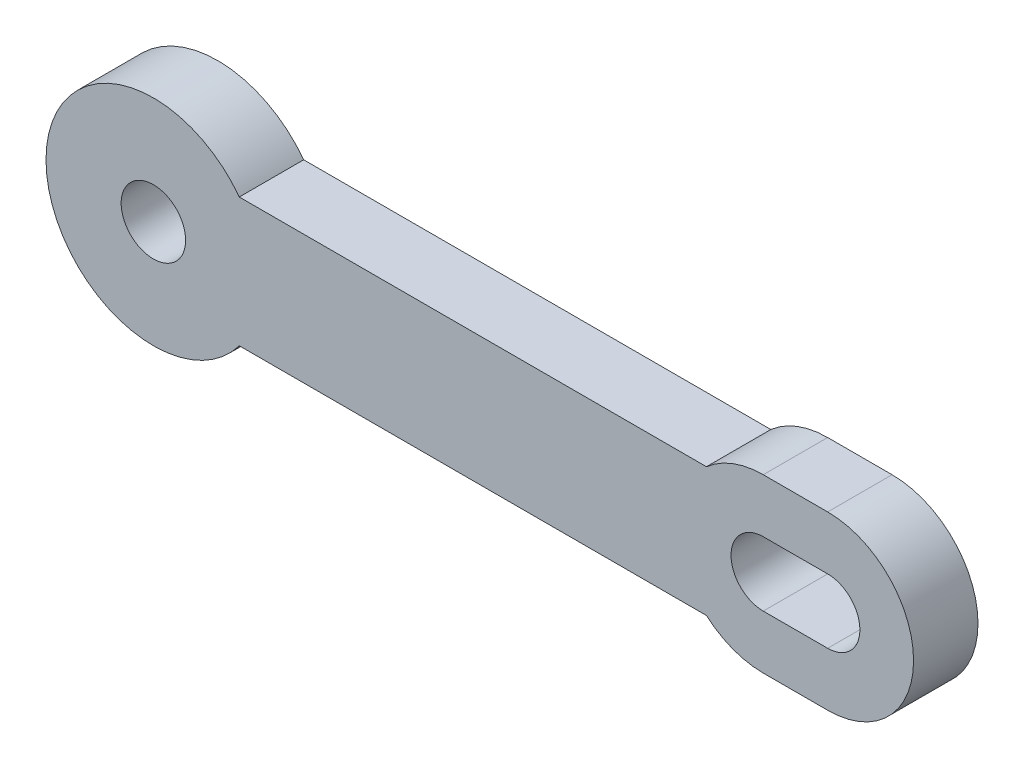
ISO-10303-21;
HEADER;
FILE_DESCRIPTION(('STEP AP214'),'2;1');
FILE_NAME('part.step','',(''),(''),'','','');
FILE_SCHEMA(('AUTOMOTIVE_DESIGN { 1 0 10303 214 1 1 1 1 }'));
ENDSEC;
DATA;
#1=APPLICATION_CONTEXT('core data for automotive mechanical design processes');
#2=APPLICATION_PROTOCOL_DEFINITION('international standard','automotive_design',2000,#1);
#3=PRODUCT_CONTEXT('',#1,'mechanical');
#4=PRODUCT('Part','Part','',(#3));
#5=PRODUCT_RELATED_PRODUCT_CATEGORY('part','',(#4));
#6=PRODUCT_DEFINITION_FORMATION('','',#4);
#7=PRODUCT_DEFINITION_CONTEXT('part definition',#1,'design');
#8=PRODUCT_DEFINITION('design','',#6,#7);
#9=PRODUCT_DEFINITION_SHAPE('','',#8);
#10=(LENGTH_UNIT() NAMED_UNIT(*) SI_UNIT(.MILLI.,.METRE.));
#11=(NAMED_UNIT(*) PLANE_ANGLE_UNIT() SI_UNIT($,.RADIAN.));
#12=(NAMED_UNIT(*) SI_UNIT($,.STERADIAN.) SOLID_ANGLE_UNIT());
#13=UNCERTAINTY_MEASURE_WITH_UNIT(LENGTH_MEASURE(1.E-05),#10,'distance_accuracy_value','');
#14=(GEOMETRIC_REPRESENTATION_CONTEXT(3) GLOBAL_UNCERTAINTY_ASSIGNED_CONTEXT((#13)) GLOBAL_UNIT_ASSIGNED_CONTEXT((#10,
#11,#12)) REPRESENTATION_CONTEXT('',''));
#15=CARTESIAN_POINT('',(0.,0.,0.));
#16=DIRECTION('',(0.,0.,1.));
#17=DIRECTION('',(1.,0.,0.));
#18=AXIS2_PLACEMENT_3D('',#15,#16,#17);
#19=CARTESIAN_POINT('',(31.4,0.,3.));
#20=DIRECTION('',(0.,0.,-1.));
#21=DIRECTION('',(-1.,0.,0.));
#22=AXIS2_PLACEMENT_3D('',#19,#20,#21);
#23=CYLINDRICAL_SURFACE('',#22,1.50000000000002);
#24=CARTESIAN_POINT('',(31.4,0.,0.));
#25=DIRECTION('',(0.,0.,1.));
#26=DIRECTION('',(1.,0.,0.));
#27=AXIS2_PLACEMENT_3D('',#24,#25,#26);
#28=CIRCLE('',#27,1.50000000000002);
#29=CARTESIAN_POINT('',(31.4,-1.5,0.));
#30=VERTEX_POINT('',#29);
#31=CARTESIAN_POINT('',(31.4,1.5,0.));
#32=VERTEX_POINT('',#31);
#33=EDGE_CURVE('E180',#30,#32,#28,.T.);
#34=ORIENTED_EDGE('',*,*,#33,.F.);
#35=DIRECTION('',(0.,0.,-1.));
#36=VECTOR('',#35,1.);
#37=CARTESIAN_POINT('',(31.4,-1.5,3.));
#38=LINE('',#37,#36);
#39=CARTESIAN_POINT('',(31.4,-1.5,3.));
#40=VERTEX_POINT('',#39);
#41=EDGE_CURVE('E11',#40,#30,#38,.T.);
#42=ORIENTED_EDGE('',*,*,#41,.F.);
#43=CARTESIAN_POINT('',(31.4,0.,3.));
#44=DIRECTION('',(0.,0.,1.));
#45=DIRECTION('',(1.,0.,0.));
#46=AXIS2_PLACEMENT_3D('',#43,#44,#45);
#47=CIRCLE('',#46,1.50000000000002);
#48=CARTESIAN_POINT('',(31.4,1.5,3.));
#49=VERTEX_POINT('',#48);
#50=EDGE_CURVE('E150',#40,#49,#47,.T.);
#51=ORIENTED_EDGE('',*,*,#50,.T.);
#52=DIRECTION('',(0.,0.,-1.));
#53=VECTOR('',#52,1.);
#54=CARTESIAN_POINT('',(31.4,1.5,3.));
#55=LINE('',#54,#53);
#56=EDGE_CURVE('E102',#49,#32,#55,.T.);
#57=ORIENTED_EDGE('',*,*,#56,.T.);
#58=EDGE_LOOP('',(#34,#42,#51,#57));
#59=FACE_BOUND('',#58,.T.);
#60=ADVANCED_FACE('F37',(#59),#23,.F.);
#61=CARTESIAN_POINT('',(0.,-1.5,3.));
#62=DIRECTION('',(0.,1.,0.));
#63=DIRECTION('',(0.,0.,1.));
#64=AXIS2_PLACEMENT_3D('',#61,#62,#63);
#65=PLANE('',#64);
#66=DIRECTION('',(1.,0.,0.));
#67=VECTOR('',#66,1.);
#68=CARTESIAN_POINT('',(0.,-1.5,0.));
#69=LINE('',#68,#67);
#70=CARTESIAN_POINT('',(28.4,-1.5,0.));
#71=VERTEX_POINT('',#70);
#72=EDGE_CURVE('E142',#71,#30,#69,.T.);
#73=ORIENTED_EDGE('',*,*,#72,.F.);
#74=DIRECTION('',(0.,0.,-1.));
#75=VECTOR('',#74,1.);
#76=CARTESIAN_POINT('',(28.4,-1.5,3.));
#77=LINE('',#76,#75);
#78=CARTESIAN_POINT('',(28.4,-1.5,3.));
#79=VERTEX_POINT('',#78);
#80=EDGE_CURVE('E47',#79,#71,#77,.T.);
#81=ORIENTED_EDGE('',*,*,#80,.F.);
#82=DIRECTION('',(1.,0.,0.));
#83=VECTOR('',#82,1.);
#84=CARTESIAN_POINT('',(0.,-1.5,3.));
#85=LINE('',#84,#83);
#86=EDGE_CURVE('E140',#79,#40,#85,.T.);
#87=ORIENTED_EDGE('',*,*,#86,.T.);
#88=ORIENTED_EDGE('',*,*,#41,.T.);
#89=EDGE_LOOP('',(#73,#81,#87,#88));
#90=FACE_BOUND('',#89,.T.);
#91=ADVANCED_FACE('F139',(#90),#65,.T.);
#92=CARTESIAN_POINT('',(28.4,0.,3.));
#93=DIRECTION('',(0.,0.,-1.));
#94=DIRECTION('',(-1.,0.,0.));
#95=AXIS2_PLACEMENT_3D('',#92,#93,#94);
#96=CYLINDRICAL_SURFACE('',#95,1.5);
#97=CARTESIAN_POINT('',(28.4,0.,0.));
#98=DIRECTION('',(0.,0.,1.));
#99=DIRECTION('',(1.,0.,0.));
#100=AXIS2_PLACEMENT_3D('',#97,#98,#99);
#101=CIRCLE('',#100,1.5);
#102=CARTESIAN_POINT('',(28.4,1.5,0.));
#103=VERTEX_POINT('',#102);
#104=EDGE_CURVE('E184',#103,#71,#101,.T.);
#105=ORIENTED_EDGE('',*,*,#104,.F.);
#106=DIRECTION('',(0.,0.,-1.));
#107=VECTOR('',#106,1.);
#108=CARTESIAN_POINT('',(28.4,1.5,3.));
#109=LINE('',#108,#107);
#110=CARTESIAN_POINT('',(28.4,1.5,3.));
#111=VERTEX_POINT('',#110);
#112=EDGE_CURVE('E95',#111,#103,#109,.T.);
#113=ORIENTED_EDGE('',*,*,#112,.F.);
#114=CARTESIAN_POINT('',(28.4,0.,3.));
#115=DIRECTION('',(0.,0.,1.));
#116=DIRECTION('',(1.,0.,0.));
#117=AXIS2_PLACEMENT_3D('',#114,#115,#116);
#118=CIRCLE('',#117,1.5);
#119=EDGE_CURVE('E149',#111,#79,#118,.T.);
#120=ORIENTED_EDGE('',*,*,#119,.T.);
#121=ORIENTED_EDGE('',*,*,#80,.T.);
#122=EDGE_LOOP('',(#105,#113,#120,#121));
#123=FACE_BOUND('',#122,.T.);
#124=ADVANCED_FACE('F152',(#123),#96,.F.);
#125=CARTESIAN_POINT('',(0.,0.,3.));
#126=DIRECTION('',(0.,0.,-1.));
#127=DIRECTION('',(-1.,0.,0.));
#128=AXIS2_PLACEMENT_3D('',#125,#126,#127);
#129=CYLINDRICAL_SURFACE('',#128,5.);
#130=CARTESIAN_POINT('',(0.,0.,0.));
#131=DIRECTION('',(0.,0.,1.));
#132=DIRECTION('',(1.,0.,0.));
#133=AXIS2_PLACEMENT_3D('',#130,#131,#132);
#134=CIRCLE('',#133,5.);
#135=CARTESIAN_POINT('',(4.,3.,0.));
#136=VERTEX_POINT('',#135);
#137=CARTESIAN_POINT('',(4.,-3.,0.));
#138=VERTEX_POINT('',#137);
#139=EDGE_CURVE('E158',#136,#138,#134,.T.);
#140=ORIENTED_EDGE('',*,*,#139,.T.);
#141=DIRECTION('',(0.,0.,-1.));
#142=VECTOR('',#141,1.);
#143=CARTESIAN_POINT('',(4.,-3.,3.));
#144=LINE('',#143,#142);
#145=CARTESIAN_POINT('',(4.,-3.,3.));
#146=VERTEX_POINT('',#145);
#147=EDGE_CURVE('E41',#146,#138,#144,.T.);
#148=ORIENTED_EDGE('',*,*,#147,.F.);
#149=CARTESIAN_POINT('',(0.,0.,3.));
#150=DIRECTION('',(0.,0.,1.));
#151=DIRECTION('',(1.,0.,0.));
#152=AXIS2_PLACEMENT_3D('',#149,#150,#151);
#153=CIRCLE('',#152,5.);
#154=CARTESIAN_POINT('',(4.,3.,3.));
#155=VERTEX_POINT('',#154);
#156=EDGE_CURVE('E188',#155,#146,#153,.T.);
#157=ORIENTED_EDGE('',*,*,#156,.F.);
#158=DIRECTION('',(0.,0.,-1.));
#159=VECTOR('',#158,1.);
#160=CARTESIAN_POINT('',(4.,3.,3.));
#161=LINE('',#160,#159);
#162=EDGE_CURVE('E154',#155,#136,#161,.T.);
#163=ORIENTED_EDGE('',*,*,#162,.T.);
#164=EDGE_LOOP('',(#140,#148,#157,#163));
#165=FACE_BOUND('',#164,.T.);
#166=ADVANCED_FACE('F39',(#165),#129,.T.);
#167=CARTESIAN_POINT('',(0.,-3.,3.));
#168=DIRECTION('',(0.,1.,0.));
#169=DIRECTION('',(0.,0.,1.));
#170=AXIS2_PLACEMENT_3D('',#167,#168,#169);
#171=PLANE('',#170);
#172=DIRECTION('',(1.,0.,0.));
#173=VECTOR('',#172,1.);
#174=CARTESIAN_POINT('',(0.,-3.,0.));
#175=LINE('',#174,#173);
#176=CARTESIAN_POINT('',(25.7542486889354,-3.,0.));
#177=VERTEX_POINT('',#176);
#178=EDGE_CURVE('E161',#138,#177,#175,.T.);
#179=ORIENTED_EDGE('',*,*,#178,.T.);
#180=DIRECTION('',(0.,0.,-1.));
#181=VECTOR('',#180,1.);
#182=CARTESIAN_POINT('',(25.7542486889354,-3.,3.));
#183=LINE('',#182,#181);
#184=CARTESIAN_POINT('',(25.7542486889354,-3.,3.));
#185=VERTEX_POINT('',#184);
#186=EDGE_CURVE('E203',#185,#177,#183,.T.);
#187=ORIENTED_EDGE('',*,*,#186,.F.);
#188=DIRECTION('',(1.,0.,0.));
#189=VECTOR('',#188,1.);
#190=CARTESIAN_POINT('',(0.,-3.,3.));
#191=LINE('',#190,#189);
#192=EDGE_CURVE('E110',#146,#185,#191,.T.);
#193=ORIENTED_EDGE('',*,*,#192,.F.);
#194=ORIENTED_EDGE('',*,*,#147,.T.);
#195=EDGE_LOOP('',(#179,#187,#193,#194));
#196=FACE_BOUND('',#195,.T.);
#197=ADVANCED_FACE('F209',(#196),#171,.F.);
#198=CARTESIAN_POINT('',(28.4,0.,3.));
#199=DIRECTION('',(0.,0.,-1.));
#200=DIRECTION('',(-1.,0.,0.));
#201=AXIS2_PLACEMENT_3D('',#198,#199,#200);
#202=CYLINDRICAL_SURFACE('',#201,4.);
#203=CARTESIAN_POINT('',(28.4,0.,0.));
#204=DIRECTION('',(0.,0.,1.));
#205=DIRECTION('',(1.,0.,0.));
#206=AXIS2_PLACEMENT_3D('',#203,#204,#205);
#207=CIRCLE('',#206,4.);
#208=CARTESIAN_POINT('',(28.4,-4.,0.));
#209=VERTEX_POINT('',#208);
#210=EDGE_CURVE('E163',#177,#209,#207,.T.);
#211=ORIENTED_EDGE('',*,*,#210,.T.);
#212=DIRECTION('',(0.,0.,-1.));
#213=VECTOR('',#212,1.);
#214=CARTESIAN_POINT('',(28.4,-4.,3.));
#215=LINE('',#214,#213);
#216=CARTESIAN_POINT('',(28.4,-4.,3.));
#217=VERTEX_POINT('',#216);
#218=EDGE_CURVE('E201',#217,#209,#215,.T.);
#219=ORIENTED_EDGE('',*,*,#218,.F.);
#220=CARTESIAN_POINT('',(28.4,0.,3.));
#221=DIRECTION('',(0.,0.,1.));
#222=DIRECTION('',(1.,0.,0.));
#223=AXIS2_PLACEMENT_3D('',#220,#221,#222);
#224=CIRCLE('',#223,4.);
#225=EDGE_CURVE('E247',#185,#217,#224,.T.);
#226=ORIENTED_EDGE('',*,*,#225,.F.);
#227=ORIENTED_EDGE('',*,*,#186,.T.);
#228=EDGE_LOOP('',(#211,#219,#226,#227));
#229=FACE_BOUND('',#228,.T.);
#230=ADVANCED_FACE('F246',(#229),#202,.T.);
#231=CARTESIAN_POINT('',(0.,-4.,3.));
#232=DIRECTION('',(0.,1.,0.));
#233=DIRECTION('',(0.,0.,1.));
#234=AXIS2_PLACEMENT_3D('',#231,#232,#233);
#235=PLANE('',#234);
#236=DIRECTION('',(1.,0.,0.));
#237=VECTOR('',#236,1.);
#238=CARTESIAN_POINT('',(0.,-4.,0.));
#239=LINE('',#238,#237);
#240=CARTESIAN_POINT('',(31.4,-4.,0.));
#241=VERTEX_POINT('',#240);
#242=EDGE_CURVE('E165',#209,#241,#239,.T.);
#243=ORIENTED_EDGE('',*,*,#242,.T.);
#244=DIRECTION('',(0.,0.,-1.));
#245=VECTOR('',#244,1.);
#246=CARTESIAN_POINT('',(31.4,-4.,3.));
#247=LINE('',#246,#245);
#248=CARTESIAN_POINT('',(31.4,-4.,3.));
#249=VERTEX_POINT('',#248);
#250=EDGE_CURVE('E198',#249,#241,#247,.T.);
#251=ORIENTED_EDGE('',*,*,#250,.F.);
#252=DIRECTION('',(1.,0.,0.));
#253=VECTOR('',#252,1.);
#254=CARTESIAN_POINT('',(0.,-4.,3.));
#255=LINE('',#254,#253);
#256=EDGE_CURVE('E245',#217,#249,#255,.T.);
#257=ORIENTED_EDGE('',*,*,#256,.F.);
#258=ORIENTED_EDGE('',*,*,#218,.T.);
#259=EDGE_LOOP('',(#243,#251,#257,#258));
#260=FACE_BOUND('',#259,.T.);
#261=ADVANCED_FACE('F242',(#260),#235,.F.);
#262=CARTESIAN_POINT('',(31.4,0.,3.));
#263=DIRECTION('',(0.,0.,-1.));
#264=DIRECTION('',(-1.,0.,0.));
#265=AXIS2_PLACEMENT_3D('',#262,#263,#264);
#266=CYLINDRICAL_SURFACE('',#265,4.);
#267=CARTESIAN_POINT('',(31.4,0.,0.));
#268=DIRECTION('',(0.,0.,1.));
#269=DIRECTION('',(1.,0.,0.));
#270=AXIS2_PLACEMENT_3D('',#267,#268,#269);
#271=CIRCLE('',#270,4.);
#272=CARTESIAN_POINT('',(31.4,4.,0.));
#273=VERTEX_POINT('',#272);
#274=EDGE_CURVE('E168',#241,#273,#271,.T.);
#275=ORIENTED_EDGE('',*,*,#274,.T.);
#276=DIRECTION('',(0.,0.,-1.));
#277=VECTOR('',#276,1.);
#278=CARTESIAN_POINT('',(31.4,4.,3.));
#279=LINE('',#278,#277);
#280=CARTESIAN_POINT('',(31.4,4.,3.));
#281=VERTEX_POINT('',#280);
#282=EDGE_CURVE('E196',#281,#273,#279,.T.);
#283=ORIENTED_EDGE('',*,*,#282,.F.);
#284=CARTESIAN_POINT('',(31.4,0.,3.));
#285=DIRECTION('',(0.,0.,1.));
#286=DIRECTION('',(1.,0.,0.));
#287=AXIS2_PLACEMENT_3D('',#284,#285,#286);
#288=CIRCLE('',#287,4.);
#289=EDGE_CURVE('E251',#249,#281,#288,.T.);
#290=ORIENTED_EDGE('',*,*,#289,.F.);
#291=ORIENTED_EDGE('',*,*,#250,.T.);
#292=EDGE_LOOP('',(#275,#283,#290,#291));
#293=FACE_BOUND('',#292,.T.);
#294=ADVANCED_FACE('F238',(#293),#266,.T.);
#295=CARTESIAN_POINT('',(0.,4.,3.));
#296=DIRECTION('',(0.,1.,0.));
#297=DIRECTION('',(0.,0.,1.));
#298=AXIS2_PLACEMENT_3D('',#295,#296,#297);
#299=PLANE('',#298);
#300=DIRECTION('',(1.,0.,0.));
#301=VECTOR('',#300,1.);
#302=CARTESIAN_POINT('',(0.,4.,0.));
#303=LINE('',#302,#301);
#304=CARTESIAN_POINT('',(28.4,4.,0.));
#305=VERTEX_POINT('',#304);
#306=EDGE_CURVE('E171',#305,#273,#303,.T.);
#307=ORIENTED_EDGE('',*,*,#306,.F.);
#308=DIRECTION('',(0.,0.,-1.));
#309=VECTOR('',#308,1.);
#310=CARTESIAN_POINT('',(28.4,4.,3.));
#311=LINE('',#310,#309);
#312=CARTESIAN_POINT('',(28.4,4.,3.));
#313=VERTEX_POINT('',#312);
#314=EDGE_CURVE('E194',#313,#305,#311,.T.);
#315=ORIENTED_EDGE('',*,*,#314,.F.);
#316=DIRECTION('',(1.,0.,0.));
#317=VECTOR('',#316,1.);
#318=CARTESIAN_POINT('',(0.,4.,3.));
#319=LINE('',#318,#317);
#320=EDGE_CURVE('E235',#313,#281,#319,.T.);
#321=ORIENTED_EDGE('',*,*,#320,.T.);
#322=ORIENTED_EDGE('',*,*,#282,.T.);
#323=EDGE_LOOP('',(#307,#315,#321,#322));
#324=FACE_BOUND('',#323,.T.);
#325=ADVANCED_FACE('F231',(#324),#299,.T.);
#326=CARTESIAN_POINT('',(25.7542486889354,3.00000000000001,0.));
#327=VERTEX_POINT('',#326);
#328=EDGE_CURVE('E166',#305,#327,#207,.T.);
#329=ORIENTED_EDGE('',*,*,#328,.T.);
#330=DIRECTION('',(0.,0.,-1.));
#331=VECTOR('',#330,1.);
#332=CARTESIAN_POINT('',(25.7542486889354,3.00000000000001,3.));
#333=LINE('',#332,#331);
#334=CARTESIAN_POINT('',(25.7542486889354,3.00000000000001,3.));
#335=VERTEX_POINT('',#334);
#336=EDGE_CURVE('E192',#335,#327,#333,.T.);
#337=ORIENTED_EDGE('',*,*,#336,.F.);
#338=EDGE_CURVE('E250',#313,#335,#224,.T.);
#339=ORIENTED_EDGE('',*,*,#338,.F.);
#340=ORIENTED_EDGE('',*,*,#314,.T.);
#341=EDGE_LOOP('',(#329,#337,#339,#340));
#342=FACE_BOUND('',#341,.T.);
#343=ADVANCED_FACE('F227',(#342),#202,.T.);
#344=CARTESIAN_POINT('',(0.,0.,3.));
#345=DIRECTION('',(0.,0.,-1.));
#346=DIRECTION('',(-1.,0.,0.));
#347=AXIS2_PLACEMENT_3D('',#344,#345,#346);
#348=CYLINDRICAL_SURFACE('',#347,1.5);
#349=CARTESIAN_POINT('',(0.,0.,3.));
#350=DIRECTION('',(0.,0.,1.));
#351=DIRECTION('',(1.,0.,0.));
#352=AXIS2_PLACEMENT_3D('',#349,#350,#351);
#353=CIRCLE('',#352,1.5);
#354=CARTESIAN_POINT('',(1.5,0.,3.));
#355=VERTEX_POINT('',#354);
#356=EDGE_CURVE('E254',#355,#355,#353,.T.);
#357=ORIENTED_EDGE('',*,*,#356,.T.);
#358=EDGE_LOOP('',(#357));
#359=FACE_BOUND('',#358,.T.);
#360=CARTESIAN_POINT('',(0.,0.,0.));
#361=DIRECTION('',(0.,0.,1.));
#362=DIRECTION('',(1.,0.,0.));
#363=AXIS2_PLACEMENT_3D('',#360,#361,#362);
#364=CIRCLE('',#363,1.5);
#365=CARTESIAN_POINT('',(1.5,0.,0.));
#366=VERTEX_POINT('',#365);
#367=EDGE_CURVE('E177',#366,#366,#364,.T.);
#368=ORIENTED_EDGE('',*,*,#367,.F.);
#369=EDGE_LOOP('',(#368));
#370=FACE_BOUND('',#369,.T.);
#371=ADVANCED_FACE('F269',(#359,#370),#348,.F.);
#372=CARTESIAN_POINT('',(0.,3.,3.));
#373=DIRECTION('',(0.,1.,0.));
#374=DIRECTION('',(-1.,0.,0.));
#375=AXIS2_PLACEMENT_3D('',#372,#373,#374);
#376=PLANE('',#375);
#377=DIRECTION('',(1.,0.,0.));
#378=VECTOR('',#377,1.);
#379=CARTESIAN_POINT('',(0.,3.,0.));
#380=LINE('',#379,#378);
#381=EDGE_CURVE('E174',#136,#327,#380,.T.);
#382=ORIENTED_EDGE('',*,*,#381,.F.);
#383=ORIENTED_EDGE('',*,*,#162,.F.);
#384=DIRECTION('',(1.,0.,0.));
#385=VECTOR('',#384,1.);
#386=CARTESIAN_POINT('',(0.,3.,3.));
#387=LINE('',#386,#385);
#388=EDGE_CURVE('E224',#155,#335,#387,.T.);
#389=ORIENTED_EDGE('',*,*,#388,.T.);
#390=ORIENTED_EDGE('',*,*,#336,.T.);
#391=EDGE_LOOP('',(#382,#383,#389,#390));
#392=FACE_BOUND('',#391,.T.);
#393=ADVANCED_FACE('F219',(#392),#376,.T.);
#394=CARTESIAN_POINT('',(0.,1.5,3.));
#395=DIRECTION('',(0.,1.,0.));
#396=DIRECTION('',(0.,0.,1.));
#397=AXIS2_PLACEMENT_3D('',#394,#395,#396);
#398=PLANE('',#397);
#399=DIRECTION('',(1.,0.,0.));
#400=VECTOR('',#399,1.);
#401=CARTESIAN_POINT('',(0.,1.5,0.));
#402=LINE('',#401,#400);
#403=EDGE_CURVE('E186',#103,#32,#402,.T.);
#404=ORIENTED_EDGE('',*,*,#403,.T.);
#405=ORIENTED_EDGE('',*,*,#56,.F.);
#406=DIRECTION('',(1.,0.,0.));
#407=VECTOR('',#406,1.);
#408=CARTESIAN_POINT('',(0.,1.5,3.));
#409=LINE('',#408,#407);
#410=EDGE_CURVE('E56',#111,#49,#409,.T.);
#411=ORIENTED_EDGE('',*,*,#410,.F.);
#412=ORIENTED_EDGE('',*,*,#112,.T.);
#413=EDGE_LOOP('',(#404,#405,#411,#412));
#414=FACE_BOUND('',#413,.T.);
#415=ADVANCED_FACE('F261',(#414),#398,.F.);
#416=CARTESIAN_POINT('',(0.,0.,3.));
#417=DIRECTION('',(0.,0.,1.));
#418=DIRECTION('',(1.,0.,0.));
#419=AXIS2_PLACEMENT_3D('',#416,#417,#418);
#420=PLANE('',#419);
#421=ORIENTED_EDGE('',*,*,#156,.T.);
#422=ORIENTED_EDGE('',*,*,#192,.T.);
#423=ORIENTED_EDGE('',*,*,#225,.T.);
#424=ORIENTED_EDGE('',*,*,#256,.T.);
#425=ORIENTED_EDGE('',*,*,#289,.T.);
#426=ORIENTED_EDGE('',*,*,#320,.F.);
#427=ORIENTED_EDGE('',*,*,#338,.T.);
#428=ORIENTED_EDGE('',*,*,#388,.F.);
#429=EDGE_LOOP('',(#421,#422,#423,#424,#425,#426,#427,#428));
#430=FACE_BOUND('',#429,.T.);
#431=ORIENTED_EDGE('',*,*,#356,.F.);
#432=EDGE_LOOP('',(#431));
#433=FACE_BOUND('',#432,.T.);
#434=ORIENTED_EDGE('',*,*,#50,.F.);
#435=ORIENTED_EDGE('',*,*,#86,.F.);
#436=ORIENTED_EDGE('',*,*,#119,.F.);
#437=ORIENTED_EDGE('',*,*,#410,.T.);
#438=EDGE_LOOP('',(#434,#435,#436,#437));
#439=FACE_BOUND('',#438,.T.);
#440=ADVANCED_FACE('F148',(#430,#433,#439),#420,.T.);
#441=CARTESIAN_POINT('',(0.,0.,0.));
#442=DIRECTION('',(0.,0.,1.));
#443=DIRECTION('',(1.,0.,0.));
#444=AXIS2_PLACEMENT_3D('',#441,#442,#443);
#445=PLANE('',#444);
#446=ORIENTED_EDGE('',*,*,#139,.F.);
#447=ORIENTED_EDGE('',*,*,#381,.T.);
#448=ORIENTED_EDGE('',*,*,#328,.F.);
#449=ORIENTED_EDGE('',*,*,#306,.T.);
#450=ORIENTED_EDGE('',*,*,#274,.F.);
#451=ORIENTED_EDGE('',*,*,#242,.F.);
#452=ORIENTED_EDGE('',*,*,#210,.F.);
#453=ORIENTED_EDGE('',*,*,#178,.F.);
#454=EDGE_LOOP('',(#446,#447,#448,#449,#450,#451,#452,#453));
#455=FACE_BOUND('',#454,.T.);
#456=ORIENTED_EDGE('',*,*,#367,.T.);
#457=EDGE_LOOP('',(#456));
#458=FACE_BOUND('',#457,.T.);
#459=ORIENTED_EDGE('',*,*,#33,.T.);
#460=ORIENTED_EDGE('',*,*,#403,.F.);
#461=ORIENTED_EDGE('',*,*,#104,.T.);
#462=ORIENTED_EDGE('',*,*,#72,.T.);
#463=EDGE_LOOP('',(#459,#460,#461,#462));
#464=FACE_BOUND('',#463,.T.);
#465=ADVANCED_FACE('F215',(#455,#458,#464),#445,.F.);
#466=CLOSED_SHELL('',(#60,#91,#124,#166,#197,#230,#261,#294,#325,#343,#371,#393,#415,#440,#465));
#467=MANIFOLD_SOLID_BREP('B2',#466);
#468=ADVANCED_BREP_SHAPE_REPRESENTATION('',(#18,#467),#14);
#469=SHAPE_DEFINITION_REPRESENTATION(#9,#468);
ENDSEC;
END-ISO-10303-21;
